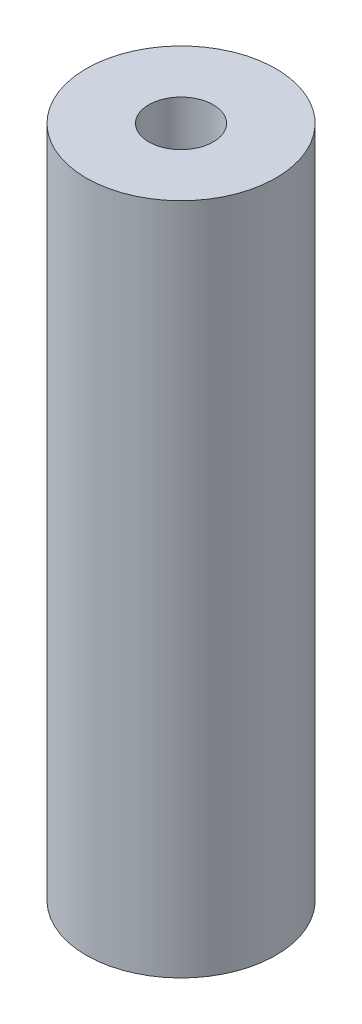
ISO-10303-21;
HEADER;
FILE_DESCRIPTION(('STEP AP214'),'2;1');
FILE_NAME('part.step','',(''),(''),'','','');
FILE_SCHEMA(('AUTOMOTIVE_DESIGN { 1 0 10303 214 1 1 1 1 }'));
ENDSEC;
DATA;
#1=APPLICATION_CONTEXT('core data for automotive mechanical design processes');
#2=APPLICATION_PROTOCOL_DEFINITION('international standard','automotive_design',2000,#1);
#3=PRODUCT_CONTEXT('',#1,'mechanical');
#4=PRODUCT('Part','Part','',(#3));
#5=PRODUCT_RELATED_PRODUCT_CATEGORY('part','',(#4));
#6=PRODUCT_DEFINITION_FORMATION('','',#4);
#7=PRODUCT_DEFINITION_CONTEXT('part definition',#1,'design');
#8=PRODUCT_DEFINITION('design','',#6,#7);
#9=PRODUCT_DEFINITION_SHAPE('','',#8);
#10=(LENGTH_UNIT() NAMED_UNIT(*) SI_UNIT(.MILLI.,.METRE.));
#11=(NAMED_UNIT(*) PLANE_ANGLE_UNIT() SI_UNIT($,.RADIAN.));
#12=(NAMED_UNIT(*) SI_UNIT($,.STERADIAN.) SOLID_ANGLE_UNIT());
#13=UNCERTAINTY_MEASURE_WITH_UNIT(LENGTH_MEASURE(1.E-05),#10,'distance_accuracy_value','');
#14=(GEOMETRIC_REPRESENTATION_CONTEXT(3) GLOBAL_UNCERTAINTY_ASSIGNED_CONTEXT((#13)) GLOBAL_UNIT_ASSIGNED_CONTEXT((#10,
#11,#12)) REPRESENTATION_CONTEXT('',''));
#15=CARTESIAN_POINT('',(0.,0.,0.));
#16=DIRECTION('',(0.,0.,1.));
#17=DIRECTION('',(1.,0.,0.));
#18=AXIS2_PLACEMENT_3D('',#15,#16,#17);
#19=CARTESIAN_POINT('',(0.,35.5,0.));
#20=DIRECTION('',(0.,-1.,0.));
#21=DIRECTION('',(0.,0.,-1.));
#22=AXIS2_PLACEMENT_3D('',#19,#20,#21);
#23=CYLINDRICAL_SURFACE('',#22,5.);
#24=CARTESIAN_POINT('',(0.,35.5,0.));
#25=DIRECTION('',(0.,1.,0.));
#26=DIRECTION('',(0.,0.,1.));
#27=AXIS2_PLACEMENT_3D('',#24,#25,#26);
#28=CIRCLE('',#27,5.);
#29=CARTESIAN_POINT('',(0.,35.5,5.));
#30=VERTEX_POINT('',#29);
#31=EDGE_CURVE('E10',#30,#30,#28,.T.);
#32=ORIENTED_EDGE('',*,*,#31,.F.);
#33=EDGE_LOOP('',(#32));
#34=FACE_BOUND('',#33,.T.);
#35=CARTESIAN_POINT('',(0.,0.,0.));
#36=DIRECTION('',(0.,1.,0.));
#37=DIRECTION('',(0.,0.,1.));
#38=AXIS2_PLACEMENT_3D('',#35,#36,#37);
#39=CIRCLE('',#38,5.);
#40=CARTESIAN_POINT('',(0.,0.,5.));
#41=VERTEX_POINT('',#40);
#42=EDGE_CURVE('E35',#41,#41,#39,.T.);
#43=ORIENTED_EDGE('',*,*,#42,.T.);
#44=EDGE_LOOP('',(#43));
#45=FACE_BOUND('',#44,.T.);
#46=ADVANCED_FACE('F32',(#34,#45),#23,.T.);
#47=CARTESIAN_POINT('',(0.,35.5,0.));
#48=DIRECTION('',(0.,1.,0.));
#49=DIRECTION('',(0.,0.,1.));
#50=AXIS2_PLACEMENT_3D('',#47,#48,#49);
#51=PLANE('',#50);
#52=CARTESIAN_POINT('',(0.,35.5,0.));
#53=DIRECTION('',(0.,1.,0.));
#54=DIRECTION('',(0.,0.,1.));
#55=AXIS2_PLACEMENT_3D('',#52,#53,#54);
#56=CIRCLE('',#55,1.7);
#57=CARTESIAN_POINT('',(0.,35.5,1.7));
#58=VERTEX_POINT('',#57);
#59=EDGE_CURVE('E46',#58,#58,#56,.T.);
#60=ORIENTED_EDGE('',*,*,#59,.F.);
#61=EDGE_LOOP('',(#60));
#62=FACE_BOUND('',#61,.T.);
#63=ORIENTED_EDGE('',*,*,#31,.T.);
#64=EDGE_LOOP('',(#63));
#65=FACE_BOUND('',#64,.T.);
#66=ADVANCED_FACE('F52',(#62,#65),#51,.T.);
#67=CARTESIAN_POINT('',(0.,0.,0.));
#68=DIRECTION('',(0.,1.,0.));
#69=DIRECTION('',(0.,0.,1.));
#70=AXIS2_PLACEMENT_3D('',#67,#68,#69);
#71=PLANE('',#70);
#72=CARTESIAN_POINT('',(0.,0.,0.));
#73=DIRECTION('',(0.,1.,0.));
#74=DIRECTION('',(0.,0.,1.));
#75=AXIS2_PLACEMENT_3D('',#72,#73,#74);
#76=CIRCLE('',#75,1.69999999999999);
#77=CARTESIAN_POINT('',(0.,0.,1.69999999999999));
#78=VERTEX_POINT('',#77);
#79=EDGE_CURVE('E42',#78,#78,#76,.T.);
#80=ORIENTED_EDGE('',*,*,#79,.T.);
#81=EDGE_LOOP('',(#80));
#82=FACE_BOUND('',#81,.T.);
#83=ORIENTED_EDGE('',*,*,#42,.F.);
#84=EDGE_LOOP('',(#83));
#85=FACE_BOUND('',#84,.T.);
#86=ADVANCED_FACE('F54',(#82,#85),#71,.F.);
#87=CARTESIAN_POINT('',(0.,35.5,0.));
#88=DIRECTION('',(0.,1.,0.));
#89=DIRECTION('',(0.,0.,1.));
#90=AXIS2_PLACEMENT_3D('',#87,#88,#89);
#91=CYLINDRICAL_SURFACE('',#90,1.69999999999999);
#92=ORIENTED_EDGE('',*,*,#79,.F.);
#93=EDGE_LOOP('',(#92));
#94=FACE_BOUND('',#93,.T.);
#95=ORIENTED_EDGE('',*,*,#59,.T.);
#96=EDGE_LOOP('',(#95));
#97=FACE_BOUND('',#96,.T.);
#98=ADVANCED_FACE('F50',(#94,#97),#91,.F.);
#99=CLOSED_SHELL('',(#46,#66,#86,#98));
#100=MANIFOLD_SOLID_BREP('B2',#99);
#101=ADVANCED_BREP_SHAPE_REPRESENTATION('',(#18,#100),#14);
#102=SHAPE_DEFINITION_REPRESENTATION(#9,#101);
ENDSEC;
END-ISO-10303-21;
